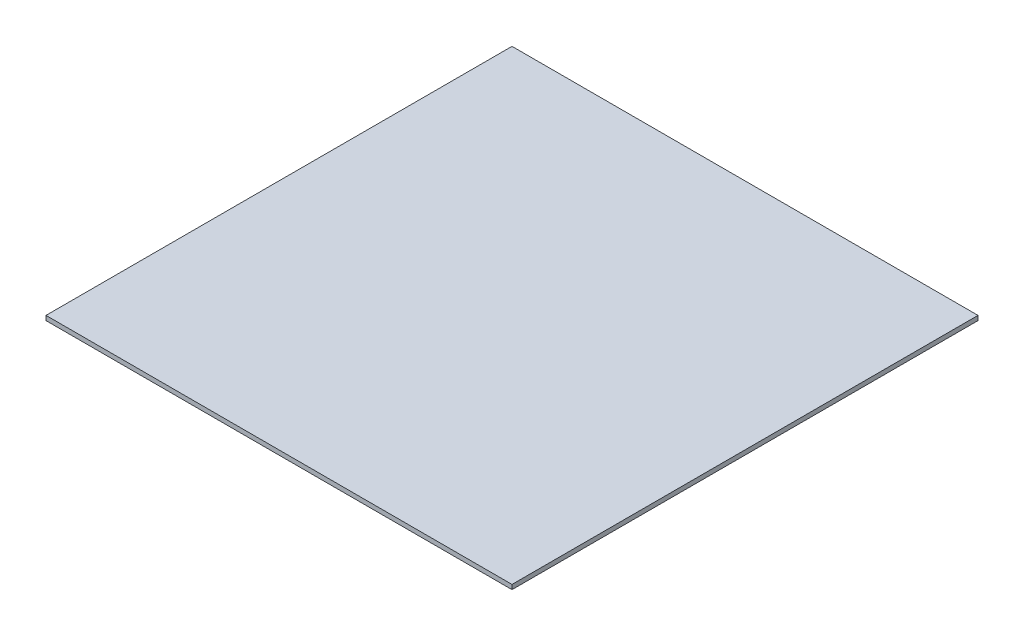
ISO-10303-21;
HEADER;
FILE_DESCRIPTION(('STEP AP214'),'2;1');
FILE_NAME('part.step','',(''),(''),'','','');
FILE_SCHEMA(('AUTOMOTIVE_DESIGN { 1 0 10303 214 1 1 1 1 }'));
ENDSEC;
DATA;
#1=APPLICATION_CONTEXT('core data for automotive mechanical design processes');
#2=APPLICATION_PROTOCOL_DEFINITION('international standard','automotive_design',2000,#1);
#3=PRODUCT_CONTEXT('',#1,'mechanical');
#4=PRODUCT('Part','Part','',(#3));
#5=PRODUCT_RELATED_PRODUCT_CATEGORY('part','',(#4));
#6=PRODUCT_DEFINITION_FORMATION('','',#4);
#7=PRODUCT_DEFINITION_CONTEXT('part definition',#1,'design');
#8=PRODUCT_DEFINITION('design','',#6,#7);
#9=PRODUCT_DEFINITION_SHAPE('','',#8);
#10=(LENGTH_UNIT() NAMED_UNIT(*) SI_UNIT(.MILLI.,.METRE.));
#11=(NAMED_UNIT(*) PLANE_ANGLE_UNIT() SI_UNIT($,.RADIAN.));
#12=(NAMED_UNIT(*) SI_UNIT($,.STERADIAN.) SOLID_ANGLE_UNIT());
#13=UNCERTAINTY_MEASURE_WITH_UNIT(LENGTH_MEASURE(1.E-05),#10,'distance_accuracy_value','');
#14=(GEOMETRIC_REPRESENTATION_CONTEXT(3) GLOBAL_UNCERTAINTY_ASSIGNED_CONTEXT((#13)) GLOBAL_UNIT_ASSIGNED_CONTEXT((#10,
#11,#12)) REPRESENTATION_CONTEXT('',''));
#15=CARTESIAN_POINT('',(0.,0.,0.));
#16=DIRECTION('',(0.,0.,1.));
#17=DIRECTION('',(1.,0.,0.));
#18=AXIS2_PLACEMENT_3D('',#15,#16,#17);
#19=CARTESIAN_POINT('',(205.,4.,-205.));
#20=DIRECTION('',(-1.,0.,0.));
#21=DIRECTION('',(0.,0.,1.));
#22=AXIS2_PLACEMENT_3D('',#19,#20,#21);
#23=PLANE('',#22);
#24=DIRECTION('',(0.,0.,-1.));
#25=VECTOR('',#24,1.);
#26=CARTESIAN_POINT('',(205.,0.,-205.));
#27=LINE('',#26,#25);
#28=CARTESIAN_POINT('',(205.,0.,205.));
#29=VERTEX_POINT('',#28);
#30=CARTESIAN_POINT('',(205.,0.,-205.));
#31=VERTEX_POINT('',#30);
#32=EDGE_CURVE('E104',#29,#31,#27,.T.);
#33=ORIENTED_EDGE('',*,*,#32,.T.);
#34=DIRECTION('',(0.,-1.,0.));
#35=VECTOR('',#34,1.);
#36=CARTESIAN_POINT('',(205.,4.,-205.));
#37=LINE('',#36,#35);
#38=CARTESIAN_POINT('',(205.,4.,-205.));
#39=VERTEX_POINT('',#38);
#40=EDGE_CURVE('E11',#39,#31,#37,.T.);
#41=ORIENTED_EDGE('',*,*,#40,.F.);
#42=DIRECTION('',(0.,0.,-1.));
#43=VECTOR('',#42,1.);
#44=CARTESIAN_POINT('',(205.,4.,-205.));
#45=LINE('',#44,#43);
#46=CARTESIAN_POINT('',(205.,4.,205.));
#47=VERTEX_POINT('',#46);
#48=EDGE_CURVE('E92',#47,#39,#45,.T.);
#49=ORIENTED_EDGE('',*,*,#48,.F.);
#50=DIRECTION('',(0.,-1.,0.));
#51=VECTOR('',#50,1.);
#52=CARTESIAN_POINT('',(205.,4.,205.));
#53=LINE('',#52,#51);
#54=EDGE_CURVE('E100',#47,#29,#53,.T.);
#55=ORIENTED_EDGE('',*,*,#54,.T.);
#56=EDGE_LOOP('',(#33,#41,#49,#55));
#57=FACE_BOUND('',#56,.T.);
#58=ADVANCED_FACE('F41',(#57),#23,.F.);
#59=CARTESIAN_POINT('',(-205.,4.,-205.));
#60=DIRECTION('',(0.,0.,1.));
#61=DIRECTION('',(1.,0.,0.));
#62=AXIS2_PLACEMENT_3D('',#59,#60,#61);
#63=PLANE('',#62);
#64=DIRECTION('',(-1.,0.,0.));
#65=VECTOR('',#64,1.);
#66=CARTESIAN_POINT('',(-205.,0.,-205.));
#67=LINE('',#66,#65);
#68=CARTESIAN_POINT('',(-205.,0.,-205.));
#69=VERTEX_POINT('',#68);
#70=EDGE_CURVE('E96',#31,#69,#67,.T.);
#71=ORIENTED_EDGE('',*,*,#70,.T.);
#72=DIRECTION('',(0.,-1.,0.));
#73=VECTOR('',#72,1.);
#74=CARTESIAN_POINT('',(-205.,4.,-205.));
#75=LINE('',#74,#73);
#76=CARTESIAN_POINT('',(-205.,4.,-205.));
#77=VERTEX_POINT('',#76);
#78=EDGE_CURVE('E49',#77,#69,#75,.T.);
#79=ORIENTED_EDGE('',*,*,#78,.F.);
#80=DIRECTION('',(-1.,0.,0.));
#81=VECTOR('',#80,1.);
#82=CARTESIAN_POINT('',(-205.,4.,-205.));
#83=LINE('',#82,#81);
#84=EDGE_CURVE('E87',#39,#77,#83,.T.);
#85=ORIENTED_EDGE('',*,*,#84,.F.);
#86=ORIENTED_EDGE('',*,*,#40,.T.);
#87=EDGE_LOOP('',(#71,#79,#85,#86));
#88=FACE_BOUND('',#87,.T.);
#89=ADVANCED_FACE('F95',(#88),#63,.F.);
#90=CARTESIAN_POINT('',(-205.,4.,-205.));
#91=DIRECTION('',(1.,0.,0.));
#92=DIRECTION('',(0.,0.,-1.));
#93=AXIS2_PLACEMENT_3D('',#90,#91,#92);
#94=PLANE('',#93);
#95=DIRECTION('',(0.,0.,1.));
#96=VECTOR('',#95,1.);
#97=CARTESIAN_POINT('',(-205.,0.,-205.));
#98=LINE('',#97,#96);
#99=CARTESIAN_POINT('',(-205.,0.,205.));
#100=VERTEX_POINT('',#99);
#101=EDGE_CURVE('E74',#69,#100,#98,.T.);
#102=ORIENTED_EDGE('',*,*,#101,.T.);
#103=DIRECTION('',(0.,-1.,0.));
#104=VECTOR('',#103,1.);
#105=CARTESIAN_POINT('',(-205.,4.,205.));
#106=LINE('',#105,#104);
#107=CARTESIAN_POINT('',(-205.,4.,205.));
#108=VERTEX_POINT('',#107);
#109=EDGE_CURVE('E97',#108,#100,#106,.T.);
#110=ORIENTED_EDGE('',*,*,#109,.F.);
#111=DIRECTION('',(0.,0.,1.));
#112=VECTOR('',#111,1.);
#113=CARTESIAN_POINT('',(-205.,4.,-205.));
#114=LINE('',#113,#112);
#115=EDGE_CURVE('E90',#77,#108,#114,.T.);
#116=ORIENTED_EDGE('',*,*,#115,.F.);
#117=ORIENTED_EDGE('',*,*,#78,.T.);
#118=EDGE_LOOP('',(#102,#110,#116,#117));
#119=FACE_BOUND('',#118,.T.);
#120=ADVANCED_FACE('F98',(#119),#94,.F.);
#121=CARTESIAN_POINT('',(-205.,4.,205.));
#122=DIRECTION('',(0.,0.,-1.));
#123=DIRECTION('',(-1.,0.,0.));
#124=AXIS2_PLACEMENT_3D('',#121,#122,#123);
#125=PLANE('',#124);
#126=DIRECTION('',(1.,0.,0.));
#127=VECTOR('',#126,1.);
#128=CARTESIAN_POINT('',(-205.,0.,205.));
#129=LINE('',#128,#127);
#130=EDGE_CURVE('E80',#100,#29,#129,.T.);
#131=ORIENTED_EDGE('',*,*,#130,.T.);
#132=ORIENTED_EDGE('',*,*,#54,.F.);
#133=DIRECTION('',(1.,0.,0.));
#134=VECTOR('',#133,1.);
#135=CARTESIAN_POINT('',(-205.,4.,205.));
#136=LINE('',#135,#134);
#137=EDGE_CURVE('E57',#108,#47,#136,.T.);
#138=ORIENTED_EDGE('',*,*,#137,.F.);
#139=ORIENTED_EDGE('',*,*,#109,.T.);
#140=EDGE_LOOP('',(#131,#132,#138,#139));
#141=FACE_BOUND('',#140,.T.);
#142=ADVANCED_FACE('F111',(#141),#125,.F.);
#143=CARTESIAN_POINT('',(0.,4.,0.));
#144=DIRECTION('',(0.,1.,0.));
#145=DIRECTION('',(0.,0.,1.));
#146=AXIS2_PLACEMENT_3D('',#143,#144,#145);
#147=PLANE('',#146);
#148=ORIENTED_EDGE('',*,*,#48,.T.);
#149=ORIENTED_EDGE('',*,*,#84,.T.);
#150=ORIENTED_EDGE('',*,*,#115,.T.);
#151=ORIENTED_EDGE('',*,*,#137,.T.);
#152=EDGE_LOOP('',(#148,#149,#150,#151));
#153=FACE_BOUND('',#152,.T.);
#154=ADVANCED_FACE('F88',(#153),#147,.T.);
#155=CARTESIAN_POINT('',(0.,0.,0.));
#156=DIRECTION('',(0.,1.,0.));
#157=DIRECTION('',(0.,0.,1.));
#158=AXIS2_PLACEMENT_3D('',#155,#156,#157);
#159=PLANE('',#158);
#160=ORIENTED_EDGE('',*,*,#32,.F.);
#161=ORIENTED_EDGE('',*,*,#130,.F.);
#162=ORIENTED_EDGE('',*,*,#101,.F.);
#163=ORIENTED_EDGE('',*,*,#70,.F.);
#164=EDGE_LOOP('',(#160,#161,#162,#163));
#165=FACE_BOUND('',#164,.T.);
#166=ADVANCED_FACE('F114',(#165),#159,.F.);
#167=CLOSED_SHELL('',(#58,#89,#120,#142,#154,#166));
#168=MANIFOLD_SOLID_BREP('B2',#167);
#169=ADVANCED_BREP_SHAPE_REPRESENTATION('',(#18,#168),#14);
#170=SHAPE_DEFINITION_REPRESENTATION(#9,#169);
ENDSEC;
END-ISO-10303-21;
